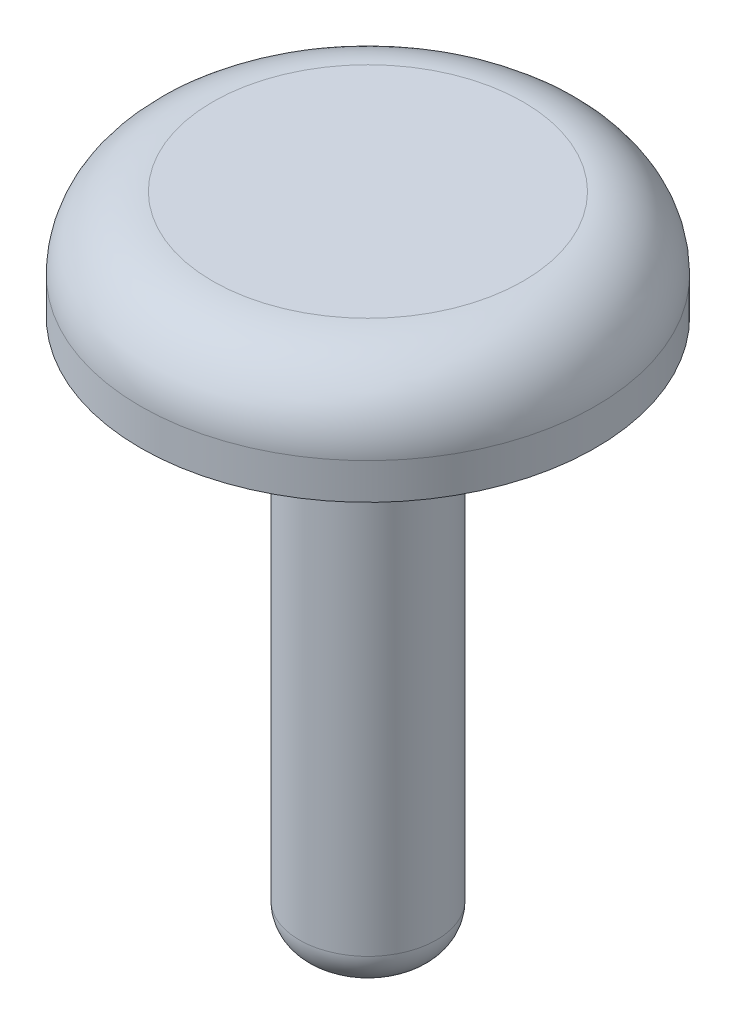
ISO-10303-21;
HEADER;
FILE_DESCRIPTION(('STEP AP214'),'2;1');
FILE_NAME('part.step','',(''),(''),'','','');
FILE_SCHEMA(('AUTOMOTIVE_DESIGN { 1 0 10303 214 1 1 1 1 }'));
ENDSEC;
DATA;
#1=APPLICATION_CONTEXT('core data for automotive mechanical design processes');
#2=APPLICATION_PROTOCOL_DEFINITION('international standard','automotive_design',2000,#1);
#3=PRODUCT_CONTEXT('',#1,'mechanical');
#4=PRODUCT('Part','Part','',(#3));
#5=PRODUCT_RELATED_PRODUCT_CATEGORY('part','',(#4));
#6=PRODUCT_DEFINITION_FORMATION('','',#4);
#7=PRODUCT_DEFINITION_CONTEXT('part definition',#1,'design');
#8=PRODUCT_DEFINITION('design','',#6,#7);
#9=PRODUCT_DEFINITION_SHAPE('','',#8);
#10=(LENGTH_UNIT() NAMED_UNIT(*) SI_UNIT(.MILLI.,.METRE.));
#11=(NAMED_UNIT(*) PLANE_ANGLE_UNIT() SI_UNIT($,.RADIAN.));
#12=(NAMED_UNIT(*) SI_UNIT($,.STERADIAN.) SOLID_ANGLE_UNIT());
#13=UNCERTAINTY_MEASURE_WITH_UNIT(LENGTH_MEASURE(1.E-05),#10,'distance_accuracy_value','');
#14=(GEOMETRIC_REPRESENTATION_CONTEXT(3) GLOBAL_UNCERTAINTY_ASSIGNED_CONTEXT((#13)) GLOBAL_UNIT_ASSIGNED_CONTEXT((#10,
#11,#12)) REPRESENTATION_CONTEXT('',''));
#15=CARTESIAN_POINT('',(0.,0.,0.));
#16=DIRECTION('',(0.,0.,1.));
#17=DIRECTION('',(1.,0.,0.));
#18=AXIS2_PLACEMENT_3D('',#15,#16,#17);
#19=CARTESIAN_POINT('',(0.,7.5,0.));
#20=DIRECTION('',(0.,1.,0.));
#21=DIRECTION('',(0.,0.,1.));
#22=AXIS2_PLACEMENT_3D('',#19,#20,#21);
#23=PLANE('',#22);
#24=CARTESIAN_POINT('',(0.,7.5,0.));
#25=DIRECTION('',(0.,-1.,0.));
#26=DIRECTION('',(0.,0.,-1.));
#27=AXIS2_PLACEMENT_3D('',#24,#25,#26);
#28=CIRCLE('',#27,2.65);
#29=CARTESIAN_POINT('',(0.,7.5,-2.65));
#30=VERTEX_POINT('',#29);
#31=EDGE_CURVE('E57',#30,#30,#28,.T.);
#32=ORIENTED_EDGE('',*,*,#31,.F.);
#33=EDGE_LOOP('',(#32));
#34=FACE_BOUND('',#33,.T.);
#35=CARTESIAN_POINT('',(0.,7.5,0.));
#36=DIRECTION('',(0.,1.,0.));
#37=DIRECTION('',(0.,0.,1.));
#38=AXIS2_PLACEMENT_3D('',#35,#36,#37);
#39=CIRCLE('',#38,3.15);
#40=CARTESIAN_POINT('',(0.,7.5,3.15));
#41=VERTEX_POINT('',#40);
#42=EDGE_CURVE('E53',#41,#41,#39,.T.);
#43=ORIENTED_EDGE('',*,*,#42,.F.);
#44=EDGE_LOOP('',(#43));
#45=FACE_BOUND('',#44,.T.);
#46=ADVANCED_FACE('F33',(#34,#45),#23,.F.);
#47=CARTESIAN_POINT('',(0.,7.5,0.));
#48=DIRECTION('',(0.,1.,0.));
#49=DIRECTION('',(0.,0.,1.));
#50=AXIS2_PLACEMENT_3D('',#47,#48,#49);
#51=CYLINDRICAL_SURFACE('',#50,3.15);
#52=CARTESIAN_POINT('',(0.,8.0001,0.));
#53=DIRECTION('',(0.,1.,0.));
#54=DIRECTION('',(0.,0.,1.));
#55=AXIS2_PLACEMENT_3D('',#52,#53,#54);
#56=CIRCLE('',#55,3.15);
#57=CARTESIAN_POINT('',(0.,8.0001,3.15));
#58=VERTEX_POINT('',#57);
#59=EDGE_CURVE('E10',#58,#58,#56,.F.);
#60=ORIENTED_EDGE('',*,*,#59,.T.);
#61=EDGE_LOOP('',(#60));
#62=FACE_BOUND('',#61,.T.);
#63=ORIENTED_EDGE('',*,*,#42,.T.);
#64=EDGE_LOOP('',(#63));
#65=FACE_BOUND('',#64,.T.);
#66=ADVANCED_FACE('F81',(#62,#65),#51,.T.);
#67=CARTESIAN_POINT('',(0.,9.0001,0.));
#68=DIRECTION('',(0.,1.,0.));
#69=DIRECTION('',(0.,0.,1.));
#70=AXIS2_PLACEMENT_3D('',#67,#68,#69);
#71=PLANE('',#70);
#72=CARTESIAN_POINT('',(0.,9.0001,0.));
#73=DIRECTION('',(0.,1.,0.));
#74=DIRECTION('',(0.,0.,1.));
#75=AXIS2_PLACEMENT_3D('',#72,#73,#74);
#76=CIRCLE('',#75,2.15);
#77=CARTESIAN_POINT('',(0.,9.0001,2.15));
#78=VERTEX_POINT('',#77);
#79=EDGE_CURVE('E40',#78,#78,#76,.T.);
#80=ORIENTED_EDGE('',*,*,#79,.T.);
#81=EDGE_LOOP('',(#80));
#82=FACE_BOUND('',#81,.T.);
#83=ADVANCED_FACE('F87',(#82),#71,.T.);
#84=CARTESIAN_POINT('',(0.,8.0001,0.));
#85=DIRECTION('',(0.,1.,0.));
#86=DIRECTION('',(0.,0.,1.));
#87=AXIS2_PLACEMENT_3D('',#84,#85,#86);
#88=TOROIDAL_SURFACE('',#87,2.15,1.);
#89=ORIENTED_EDGE('',*,*,#59,.F.);
#90=EDGE_LOOP('',(#89));
#91=FACE_BOUND('',#90,.T.);
#92=ORIENTED_EDGE('',*,*,#79,.F.);
#93=EDGE_LOOP('',(#92));
#94=FACE_BOUND('',#93,.T.);
#95=ADVANCED_FACE('F35',(#91,#94),#88,.T.);
#96=CARTESIAN_POINT('',(0.,8.5,0.));
#97=DIRECTION('',(0.,-1.,0.));
#98=DIRECTION('',(0.,0.,-1.));
#99=AXIS2_PLACEMENT_3D('',#96,#97,#98);
#100=CYLINDRICAL_SURFACE('',#99,2.65);
#101=CARTESIAN_POINT('',(0.,8.5,0.));
#102=DIRECTION('',(0.,-1.,0.));
#103=DIRECTION('',(0.,0.,-1.));
#104=AXIS2_PLACEMENT_3D('',#101,#102,#103);
#105=CIRCLE('',#104,2.65);
#106=CARTESIAN_POINT('',(0.,8.5,-2.65));
#107=VERTEX_POINT('',#106);
#108=EDGE_CURVE('E56',#107,#107,#105,.T.);
#109=ORIENTED_EDGE('',*,*,#108,.F.);
#110=EDGE_LOOP('',(#109));
#111=FACE_BOUND('',#110,.T.);
#112=ORIENTED_EDGE('',*,*,#31,.T.);
#113=EDGE_LOOP('',(#112));
#114=FACE_BOUND('',#113,.T.);
#115=ADVANCED_FACE('F98',(#111,#114),#100,.F.);
#116=CARTESIAN_POINT('',(0.,8.5,0.));
#117=DIRECTION('',(0.,-1.,0.));
#118=DIRECTION('',(0.,0.,-1.));
#119=AXIS2_PLACEMENT_3D('',#116,#117,#118);
#120=PLANE('',#119);
#121=CARTESIAN_POINT('',(0.,8.5,0.));
#122=DIRECTION('',(0.,-1.,0.));
#123=DIRECTION('',(0.,0.,-1.));
#124=AXIS2_PLACEMENT_3D('',#121,#122,#123);
#125=CIRCLE('',#124,0.95);
#126=CARTESIAN_POINT('',(0.,8.5,-0.95));
#127=VERTEX_POINT('',#126);
#128=EDGE_CURVE('E60',#127,#127,#125,.F.);
#129=ORIENTED_EDGE('',*,*,#128,.T.);
#130=EDGE_LOOP('',(#129));
#131=FACE_BOUND('',#130,.T.);
#132=ORIENTED_EDGE('',*,*,#108,.T.);
#133=EDGE_LOOP('',(#132));
#134=FACE_BOUND('',#133,.T.);
#135=ADVANCED_FACE('F66',(#131,#134),#120,.T.);
#136=CARTESIAN_POINT('',(0.,0.,0.));
#137=DIRECTION('',(0.,1.,0.));
#138=DIRECTION('',(0.,0.,1.));
#139=AXIS2_PLACEMENT_3D('',#136,#137,#138);
#140=PLANE('',#139);
#141=CARTESIAN_POINT('',(0.,0.,0.));
#142=DIRECTION('',(0.,1.,0.));
#143=DIRECTION('',(0.,0.,1.));
#144=AXIS2_PLACEMENT_3D('',#141,#142,#143);
#145=CIRCLE('',#144,0.449999999999999);
#146=CARTESIAN_POINT('',(0.,0.,0.449999999999999));
#147=VERTEX_POINT('',#146);
#148=EDGE_CURVE('E44',#147,#147,#145,.F.);
#149=ORIENTED_EDGE('',*,*,#148,.T.);
#150=EDGE_LOOP('',(#149));
#151=FACE_BOUND('',#150,.T.);
#152=ADVANCED_FACE('F77',(#151),#140,.F.);
#153=CARTESIAN_POINT('',(0.,0.5,0.));
#154=DIRECTION('',(0.,1.,0.));
#155=DIRECTION('',(0.,0.,1.));
#156=AXIS2_PLACEMENT_3D('',#153,#154,#155);
#157=DEGENERATE_TOROIDAL_SURFACE('',#156,0.449999999999999,0.5,.T.);
#158=ORIENTED_EDGE('',*,*,#148,.F.);
#159=EDGE_LOOP('',(#158));
#160=FACE_BOUND('',#159,.T.);
#161=CARTESIAN_POINT('',(0.,0.5,0.));
#162=DIRECTION('',(0.,1.,0.));
#163=DIRECTION('',(0.,0.,1.));
#164=AXIS2_PLACEMENT_3D('',#161,#162,#163);
#165=CIRCLE('',#164,0.95);
#166=CARTESIAN_POINT('',(0.,0.5,0.95));
#167=VERTEX_POINT('',#166);
#168=EDGE_CURVE('E48',#167,#167,#165,.T.);
#169=ORIENTED_EDGE('',*,*,#168,.F.);
#170=EDGE_LOOP('',(#169));
#171=FACE_BOUND('',#170,.T.);
#172=ADVANCED_FACE('F71',(#160,#171),#157,.T.);
#173=CARTESIAN_POINT('',(0.,9.,0.));
#174=DIRECTION('',(0.,-1.,0.));
#175=DIRECTION('',(0.,0.,-1.));
#176=AXIS2_PLACEMENT_3D('',#173,#174,#175);
#177=CYLINDRICAL_SURFACE('',#176,0.95);
#178=ORIENTED_EDGE('',*,*,#168,.T.);
#179=EDGE_LOOP('',(#178));
#180=FACE_BOUND('',#179,.T.);
#181=ORIENTED_EDGE('',*,*,#128,.F.);
#182=EDGE_LOOP('',(#181));
#183=FACE_BOUND('',#182,.T.);
#184=ADVANCED_FACE('F69',(#180,#183),#177,.T.);
#185=CLOSED_SHELL('',(#46,#66,#83,#95,#115,#135,#152,#172,#184));
#186=MANIFOLD_SOLID_BREP('B2',#185);
#187=ADVANCED_BREP_SHAPE_REPRESENTATION('',(#18,#186),#14);
#188=SHAPE_DEFINITION_REPRESENTATION(#9,#187);
ENDSEC;
END-ISO-10303-21;
